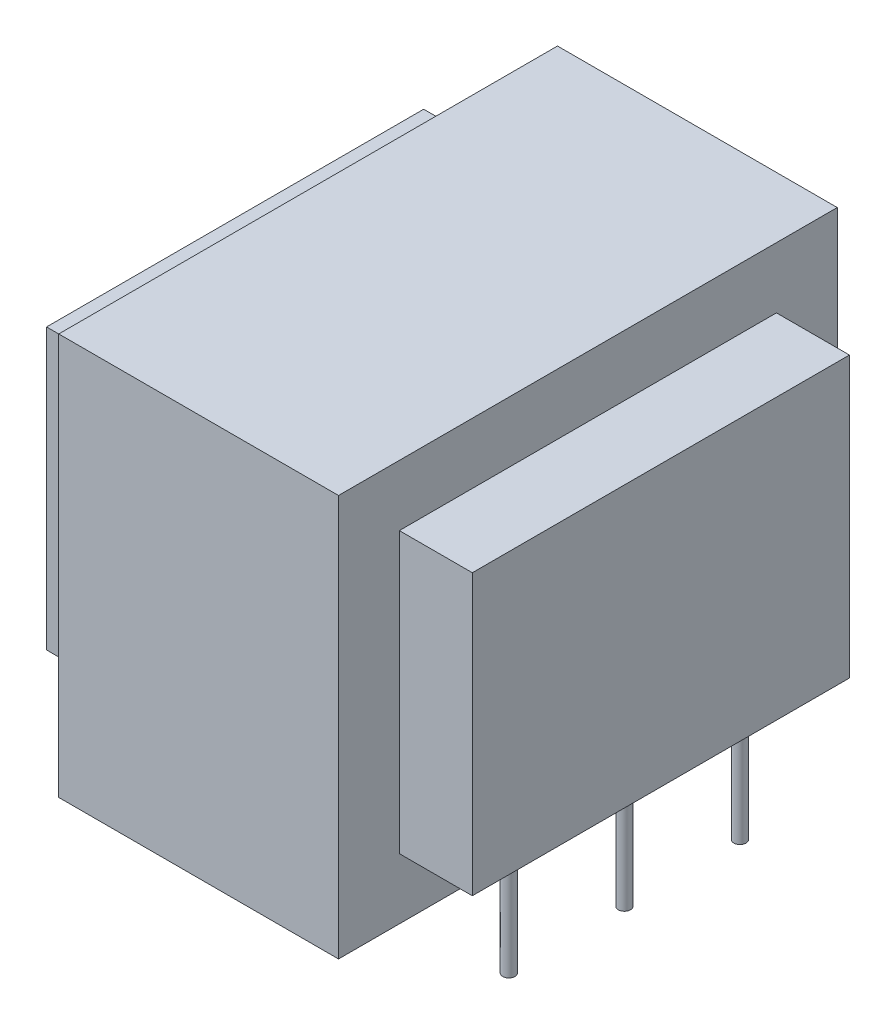
ISO-10303-21;
HEADER;
FILE_DESCRIPTION(('STEP AP214'),'2;1');
FILE_NAME('part.step','',(''),(''),'','','');
FILE_SCHEMA(('AUTOMOTIVE_DESIGN { 1 0 10303 214 1 1 1 1 }'));
ENDSEC;
DATA;
#1=APPLICATION_CONTEXT('core data for automotive mechanical design processes');
#2=APPLICATION_PROTOCOL_DEFINITION('international standard','automotive_design',2000,#1);
#3=PRODUCT_CONTEXT('',#1,'mechanical');
#4=PRODUCT('Part','Part','',(#3));
#5=PRODUCT_RELATED_PRODUCT_CATEGORY('part','',(#4));
#6=PRODUCT_DEFINITION_FORMATION('','',#4);
#7=PRODUCT_DEFINITION_CONTEXT('part definition',#1,'design');
#8=PRODUCT_DEFINITION('design','',#6,#7);
#9=PRODUCT_DEFINITION_SHAPE('','',#8);
#10=(LENGTH_UNIT() NAMED_UNIT(*) SI_UNIT(.MILLI.,.METRE.));
#11=(NAMED_UNIT(*) PLANE_ANGLE_UNIT() SI_UNIT($,.RADIAN.));
#12=(NAMED_UNIT(*) SI_UNIT($,.STERADIAN.) SOLID_ANGLE_UNIT());
#13=UNCERTAINTY_MEASURE_WITH_UNIT(LENGTH_MEASURE(1.E-05),#10,'distance_accuracy_value','');
#14=(GEOMETRIC_REPRESENTATION_CONTEXT(3) GLOBAL_UNCERTAINTY_ASSIGNED_CONTEXT((#13)) GLOBAL_UNIT_ASSIGNED_CONTEXT((#10,
#11,#12)) REPRESENTATION_CONTEXT('',''));
#15=CARTESIAN_POINT('',(0.,0.,0.));
#16=DIRECTION('',(0.,0.,1.));
#17=DIRECTION('',(1.,0.,0.));
#18=AXIS2_PLACEMENT_3D('',#15,#16,#17);
#19=CARTESIAN_POINT('',(0.,33.,0.));
#20=DIRECTION('',(0.,0.,-1.));
#21=DIRECTION('',(-1.,0.,0.));
#22=AXIS2_PLACEMENT_3D('',#19,#20,#21);
#23=PLANE('',#22);
#24=DIRECTION('',(0.,-1.,0.));
#25=VECTOR('',#24,1.);
#26=CARTESIAN_POINT('',(6.,0.,0.));
#27=LINE('',#26,#25);
#28=CARTESIAN_POINT('',(6.,33.,0.));
#29=VERTEX_POINT('',#28);
#30=CARTESIAN_POINT('',(6.,0.,0.));
#31=VERTEX_POINT('',#30);
#32=EDGE_CURVE('E157',#29,#31,#27,.T.);
#33=ORIENTED_EDGE('',*,*,#32,.T.);
#34=DIRECTION('',(1.,0.,0.));
#35=VECTOR('',#34,1.);
#36=CARTESIAN_POINT('',(0.,0.,0.));
#37=LINE('',#36,#35);
#38=CARTESIAN_POINT('',(29.,0.,0.));
#39=VERTEX_POINT('',#38);
#40=EDGE_CURVE('E210',#31,#39,#37,.T.);
#41=ORIENTED_EDGE('',*,*,#40,.T.);
#42=DIRECTION('',(0.,-1.,0.));
#43=VECTOR('',#42,1.);
#44=CARTESIAN_POINT('',(29.,0.,0.));
#45=LINE('',#44,#43);
#46=CARTESIAN_POINT('',(29.,33.,0.));
#47=VERTEX_POINT('',#46);
#48=EDGE_CURVE('E186',#47,#39,#45,.T.);
#49=ORIENTED_EDGE('',*,*,#48,.F.);
#50=DIRECTION('',(1.,0.,0.));
#51=VECTOR('',#50,1.);
#52=CARTESIAN_POINT('',(0.,33.,0.));
#53=LINE('',#52,#51);
#54=EDGE_CURVE('E217',#29,#47,#53,.T.);
#55=ORIENTED_EDGE('',*,*,#54,.F.);
#56=EDGE_LOOP('',(#33,#41,#49,#55));
#57=FACE_BOUND('',#56,.T.);
#58=ADVANCED_FACE('F36',(#57),#23,.F.);
#59=CARTESIAN_POINT('',(0.,33.,-41.));
#60=DIRECTION('',(0.,0.,1.));
#61=DIRECTION('',(1.,0.,0.));
#62=AXIS2_PLACEMENT_3D('',#59,#60,#61);
#63=PLANE('',#62);
#64=DIRECTION('',(0.,1.,0.));
#65=VECTOR('',#64,1.);
#66=CARTESIAN_POINT('',(6.,0.,-41.));
#67=LINE('',#66,#65);
#68=CARTESIAN_POINT('',(6.,0.,-41.));
#69=VERTEX_POINT('',#68);
#70=CARTESIAN_POINT('',(6.,33.,-41.));
#71=VERTEX_POINT('',#70);
#72=EDGE_CURVE('E51',#69,#71,#67,.T.);
#73=ORIENTED_EDGE('',*,*,#72,.T.);
#74=DIRECTION('',(-1.,0.,0.));
#75=VECTOR('',#74,1.);
#76=CARTESIAN_POINT('',(0.,33.,-41.));
#77=LINE('',#76,#75);
#78=CARTESIAN_POINT('',(29.,33.,-41.));
#79=VERTEX_POINT('',#78);
#80=EDGE_CURVE('E219',#79,#71,#77,.T.);
#81=ORIENTED_EDGE('',*,*,#80,.F.);
#82=DIRECTION('',(0.,1.,0.));
#83=VECTOR('',#82,1.);
#84=CARTESIAN_POINT('',(29.,0.,-41.));
#85=LINE('',#84,#83);
#86=CARTESIAN_POINT('',(29.,0.,-41.));
#87=VERTEX_POINT('',#86);
#88=EDGE_CURVE('E191',#87,#79,#85,.T.);
#89=ORIENTED_EDGE('',*,*,#88,.F.);
#90=DIRECTION('',(-1.,0.,0.));
#91=VECTOR('',#90,1.);
#92=CARTESIAN_POINT('',(0.,0.,-41.));
#93=LINE('',#92,#91);
#94=EDGE_CURVE('E220',#87,#69,#93,.T.);
#95=ORIENTED_EDGE('',*,*,#94,.T.);
#96=EDGE_LOOP('',(#73,#81,#89,#95));
#97=FACE_BOUND('',#96,.T.);
#98=ADVANCED_FACE('F249',(#97),#63,.F.);
#99=CARTESIAN_POINT('',(0.,33.,0.));
#100=DIRECTION('',(0.,-1.,0.));
#101=DIRECTION('',(0.,0.,-1.));
#102=AXIS2_PLACEMENT_3D('',#99,#100,#101);
#103=PLANE('',#102);
#104=DIRECTION('',(0.,0.,1.));
#105=VECTOR('',#104,1.);
#106=CARTESIAN_POINT('',(6.,33.,0.));
#107=LINE('',#106,#105);
#108=EDGE_CURVE('E160',#71,#29,#107,.T.);
#109=ORIENTED_EDGE('',*,*,#108,.T.);
#110=ORIENTED_EDGE('',*,*,#54,.T.);
#111=DIRECTION('',(0.,0.,1.));
#112=VECTOR('',#111,1.);
#113=CARTESIAN_POINT('',(29.,33.,0.));
#114=LINE('',#113,#112);
#115=EDGE_CURVE('E193',#79,#47,#114,.T.);
#116=ORIENTED_EDGE('',*,*,#115,.F.);
#117=ORIENTED_EDGE('',*,*,#80,.T.);
#118=EDGE_LOOP('',(#109,#110,#116,#117));
#119=FACE_BOUND('',#118,.T.);
#120=ADVANCED_FACE('F254',(#119),#103,.F.);
#121=CARTESIAN_POINT('',(0.,0.,0.));
#122=DIRECTION('',(0.,-1.,0.));
#123=DIRECTION('',(0.,0.,-1.));
#124=AXIS2_PLACEMENT_3D('',#121,#122,#123);
#125=PLANE('',#124);
#126=ORIENTED_EDGE('',*,*,#40,.F.);
#127=DIRECTION('',(0.,0.,-1.));
#128=VECTOR('',#127,1.);
#129=CARTESIAN_POINT('',(6.,0.,0.));
#130=LINE('',#129,#128);
#131=EDGE_CURVE('E133',#31,#69,#130,.T.);
#132=ORIENTED_EDGE('',*,*,#131,.T.);
#133=ORIENTED_EDGE('',*,*,#94,.F.);
#134=DIRECTION('',(0.,0.,-1.));
#135=VECTOR('',#134,1.);
#136=CARTESIAN_POINT('',(29.,0.,0.));
#137=LINE('',#136,#135);
#138=EDGE_CURVE('E189',#39,#87,#137,.T.);
#139=ORIENTED_EDGE('',*,*,#138,.F.);
#140=EDGE_LOOP('',(#126,#132,#133,#139));
#141=FACE_BOUND('',#140,.T.);
#142=ADVANCED_FACE('F262',(#141),#125,.T.);
#143=CARTESIAN_POINT('',(29.,28.,0.));
#144=DIRECTION('',(0.,1.,0.));
#145=DIRECTION('',(0.,0.,1.));
#146=AXIS2_PLACEMENT_3D('',#143,#144,#145);
#147=PLANE('',#146);
#148=DIRECTION('',(0.,0.,1.));
#149=VECTOR('',#148,1.);
#150=CARTESIAN_POINT('',(35.,28.,0.));
#151=LINE('',#150,#149);
#152=CARTESIAN_POINT('',(35.,28.,-36.));
#153=VERTEX_POINT('',#152);
#154=CARTESIAN_POINT('',(35.,28.,-5.));
#155=VERTEX_POINT('',#154);
#156=EDGE_CURVE('E172',#153,#155,#151,.T.);
#157=ORIENTED_EDGE('',*,*,#156,.F.);
#158=DIRECTION('',(1.,0.,0.));
#159=VECTOR('',#158,1.);
#160=CARTESIAN_POINT('',(29.,28.,-36.));
#161=LINE('',#160,#159);
#162=CARTESIAN_POINT('',(29.,28.,-36.));
#163=VERTEX_POINT('',#162);
#164=EDGE_CURVE('E196',#163,#153,#161,.T.);
#165=ORIENTED_EDGE('',*,*,#164,.F.);
#166=DIRECTION('',(0.,0.,1.));
#167=VECTOR('',#166,1.);
#168=CARTESIAN_POINT('',(29.,28.,0.));
#169=LINE('',#168,#167);
#170=CARTESIAN_POINT('',(29.,28.,-5.));
#171=VERTEX_POINT('',#170);
#172=EDGE_CURVE('E176',#163,#171,#169,.T.);
#173=ORIENTED_EDGE('',*,*,#172,.T.);
#174=DIRECTION('',(1.,0.,0.));
#175=VECTOR('',#174,1.);
#176=CARTESIAN_POINT('',(29.,28.,-5.));
#177=LINE('',#176,#175);
#178=EDGE_CURVE('E207',#171,#155,#177,.T.);
#179=ORIENTED_EDGE('',*,*,#178,.T.);
#180=EDGE_LOOP('',(#157,#165,#173,#179));
#181=FACE_BOUND('',#180,.T.);
#182=ADVANCED_FACE('F265',(#181),#147,.T.);
#183=CARTESIAN_POINT('',(29.,0.,-5.));
#184=DIRECTION('',(0.,0.,1.));
#185=DIRECTION('',(1.,0.,0.));
#186=AXIS2_PLACEMENT_3D('',#183,#184,#185);
#187=PLANE('',#186);
#188=DIRECTION('',(0.,-1.,0.));
#189=VECTOR('',#188,1.);
#190=CARTESIAN_POINT('',(35.,0.,-5.));
#191=LINE('',#190,#189);
#192=CARTESIAN_POINT('',(35.,5.,-5.));
#193=VERTEX_POINT('',#192);
#194=EDGE_CURVE('E180',#155,#193,#191,.T.);
#195=ORIENTED_EDGE('',*,*,#194,.F.);
#196=ORIENTED_EDGE('',*,*,#178,.F.);
#197=DIRECTION('',(0.,-1.,0.));
#198=VECTOR('',#197,1.);
#199=CARTESIAN_POINT('',(29.,0.,-5.));
#200=LINE('',#199,#198);
#201=CARTESIAN_POINT('',(29.,5.,-5.));
#202=VERTEX_POINT('',#201);
#203=EDGE_CURVE('E184',#171,#202,#200,.T.);
#204=ORIENTED_EDGE('',*,*,#203,.T.);
#205=DIRECTION('',(1.,0.,0.));
#206=VECTOR('',#205,1.);
#207=CARTESIAN_POINT('',(29.,5.,-5.));
#208=LINE('',#207,#206);
#209=EDGE_CURVE('E211',#202,#193,#208,.T.);
#210=ORIENTED_EDGE('',*,*,#209,.T.);
#211=EDGE_LOOP('',(#195,#196,#204,#210));
#212=FACE_BOUND('',#211,.T.);
#213=ADVANCED_FACE('F272',(#212),#187,.T.);
#214=CARTESIAN_POINT('',(29.,5.,0.));
#215=DIRECTION('',(0.,-1.,0.));
#216=DIRECTION('',(0.,0.,-1.));
#217=AXIS2_PLACEMENT_3D('',#214,#215,#216);
#218=PLANE('',#217);
#219=CARTESIAN_POINT('',(32.,5.,-20.5));
#220=DIRECTION('',(0.,-1.,0.));
#221=DIRECTION('',(0.,0.,1.));
#222=AXIS2_PLACEMENT_3D('',#219,#220,#221);
#223=CIRCLE('',#222,0.499999999999999);
#224=CARTESIAN_POINT('',(32.,5.,-20.));
#225=VERTEX_POINT('',#224);
#226=EDGE_CURVE('E340',#225,#225,#223,.T.);
#227=ORIENTED_EDGE('',*,*,#226,.F.);
#228=EDGE_LOOP('',(#227));
#229=FACE_BOUND('',#228,.T.);
#230=CARTESIAN_POINT('',(32.,5.,-11.));
#231=DIRECTION('',(0.,-1.,0.));
#232=DIRECTION('',(0.,0.,1.));
#233=AXIS2_PLACEMENT_3D('',#230,#231,#232);
#234=CIRCLE('',#233,0.499999999999999);
#235=CARTESIAN_POINT('',(32.,5.,-10.5));
#236=VERTEX_POINT('',#235);
#237=EDGE_CURVE('E339',#236,#236,#234,.T.);
#238=ORIENTED_EDGE('',*,*,#237,.F.);
#239=EDGE_LOOP('',(#238));
#240=FACE_BOUND('',#239,.T.);
#241=CARTESIAN_POINT('',(32.,5.,-30.));
#242=DIRECTION('',(0.,-1.,0.));
#243=DIRECTION('',(0.,0.,-1.));
#244=AXIS2_PLACEMENT_3D('',#241,#242,#243);
#245=CIRCLE('',#244,0.499999999999999);
#246=CARTESIAN_POINT('',(32.,5.,-30.5));
#247=VERTEX_POINT('',#246);
#248=EDGE_CURVE('E349',#247,#247,#245,.T.);
#249=ORIENTED_EDGE('',*,*,#248,.F.);
#250=EDGE_LOOP('',(#249));
#251=FACE_BOUND('',#250,.T.);
#252=DIRECTION('',(0.,0.,-1.));
#253=VECTOR('',#252,1.);
#254=CARTESIAN_POINT('',(35.,5.,0.));
#255=LINE('',#254,#253);
#256=CARTESIAN_POINT('',(35.,5.,-36.));
#257=VERTEX_POINT('',#256);
#258=EDGE_CURVE('E202',#193,#257,#255,.T.);
#259=ORIENTED_EDGE('',*,*,#258,.F.);
#260=ORIENTED_EDGE('',*,*,#209,.F.);
#261=DIRECTION('',(0.,0.,-1.));
#262=VECTOR('',#261,1.);
#263=CARTESIAN_POINT('',(29.,5.,0.));
#264=LINE('',#263,#262);
#265=CARTESIAN_POINT('',(29.,5.,-36.));
#266=VERTEX_POINT('',#265);
#267=EDGE_CURVE('E182',#202,#266,#264,.T.);
#268=ORIENTED_EDGE('',*,*,#267,.T.);
#269=DIRECTION('',(1.,0.,0.));
#270=VECTOR('',#269,1.);
#271=CARTESIAN_POINT('',(29.,5.,-36.));
#272=LINE('',#271,#270);
#273=EDGE_CURVE('E213',#266,#257,#272,.T.);
#274=ORIENTED_EDGE('',*,*,#273,.T.);
#275=EDGE_LOOP('',(#259,#260,#268,#274));
#276=FACE_BOUND('',#275,.T.);
#277=ADVANCED_FACE('F277',(#229,#240,#251,#276),#218,.T.);
#278=CARTESIAN_POINT('',(29.,0.,-36.));
#279=DIRECTION('',(0.,0.,-1.));
#280=DIRECTION('',(0.,1.,0.));
#281=AXIS2_PLACEMENT_3D('',#278,#279,#280);
#282=PLANE('',#281);
#283=DIRECTION('',(0.,1.,0.));
#284=VECTOR('',#283,1.);
#285=CARTESIAN_POINT('',(35.,0.,-36.));
#286=LINE('',#285,#284);
#287=EDGE_CURVE('E199',#257,#153,#286,.T.);
#288=ORIENTED_EDGE('',*,*,#287,.F.);
#289=ORIENTED_EDGE('',*,*,#273,.F.);
#290=DIRECTION('',(0.,1.,0.));
#291=VECTOR('',#290,1.);
#292=CARTESIAN_POINT('',(29.,0.,-36.));
#293=LINE('',#292,#291);
#294=EDGE_CURVE('E179',#266,#163,#293,.T.);
#295=ORIENTED_EDGE('',*,*,#294,.T.);
#296=ORIENTED_EDGE('',*,*,#164,.T.);
#297=EDGE_LOOP('',(#288,#289,#295,#296));
#298=FACE_BOUND('',#297,.T.);
#299=ADVANCED_FACE('F274',(#298),#282,.T.);
#300=CARTESIAN_POINT('',(29.,0.,0.));
#301=DIRECTION('',(1.,0.,0.));
#302=DIRECTION('',(0.,0.,-1.));
#303=AXIS2_PLACEMENT_3D('',#300,#301,#302);
#304=PLANE('',#303);
#305=ORIENTED_EDGE('',*,*,#172,.F.);
#306=ORIENTED_EDGE('',*,*,#294,.F.);
#307=ORIENTED_EDGE('',*,*,#267,.F.);
#308=ORIENTED_EDGE('',*,*,#203,.F.);
#309=EDGE_LOOP('',(#305,#306,#307,#308));
#310=FACE_BOUND('',#309,.T.);
#311=ORIENTED_EDGE('',*,*,#48,.T.);
#312=ORIENTED_EDGE('',*,*,#138,.T.);
#313=ORIENTED_EDGE('',*,*,#88,.T.);
#314=ORIENTED_EDGE('',*,*,#115,.T.);
#315=EDGE_LOOP('',(#311,#312,#313,#314));
#316=FACE_BOUND('',#315,.T.);
#317=ADVANCED_FACE('F259',(#310,#316),#304,.T.);
#318=CARTESIAN_POINT('',(35.,33.,0.));
#319=DIRECTION('',(-1.,0.,0.));
#320=DIRECTION('',(0.,0.,1.));
#321=AXIS2_PLACEMENT_3D('',#318,#319,#320);
#322=PLANE('',#321);
#323=ORIENTED_EDGE('',*,*,#156,.T.);
#324=ORIENTED_EDGE('',*,*,#194,.T.);
#325=ORIENTED_EDGE('',*,*,#258,.T.);
#326=ORIENTED_EDGE('',*,*,#287,.T.);
#327=EDGE_LOOP('',(#323,#324,#325,#326));
#328=FACE_BOUND('',#327,.T.);
#329=ADVANCED_FACE('F245',(#328),#322,.F.);
#330=CARTESIAN_POINT('',(6.,28.,0.));
#331=DIRECTION('',(0.,-1.,0.));
#332=DIRECTION('',(0.,0.,-1.));
#333=AXIS2_PLACEMENT_3D('',#330,#331,#332);
#334=PLANE('',#333);
#335=DIRECTION('',(0.,0.,1.));
#336=VECTOR('',#335,1.);
#337=CARTESIAN_POINT('',(0.,28.,0.));
#338=LINE('',#337,#336);
#339=CARTESIAN_POINT('',(0.,28.,-36.));
#340=VERTEX_POINT('',#339);
#341=CARTESIAN_POINT('',(0.,28.,-5.));
#342=VERTEX_POINT('',#341);
#343=EDGE_CURVE('E59',#340,#342,#338,.T.);
#344=ORIENTED_EDGE('',*,*,#343,.T.);
#345=DIRECTION('',(-1.,0.,0.));
#346=VECTOR('',#345,1.);
#347=CARTESIAN_POINT('',(6.,28.,-5.));
#348=LINE('',#347,#346);
#349=CARTESIAN_POINT('',(6.,28.,-5.));
#350=VERTEX_POINT('',#349);
#351=EDGE_CURVE('E123',#350,#342,#348,.T.);
#352=ORIENTED_EDGE('',*,*,#351,.F.);
#353=DIRECTION('',(0.,0.,1.));
#354=VECTOR('',#353,1.);
#355=CARTESIAN_POINT('',(6.,28.,0.));
#356=LINE('',#355,#354);
#357=CARTESIAN_POINT('',(6.,28.,-36.));
#358=VERTEX_POINT('',#357);
#359=EDGE_CURVE('E127',#358,#350,#356,.T.);
#360=ORIENTED_EDGE('',*,*,#359,.F.);
#361=DIRECTION('',(-1.,0.,0.));
#362=VECTOR('',#361,1.);
#363=CARTESIAN_POINT('',(6.,28.,-36.));
#364=LINE('',#363,#362);
#365=EDGE_CURVE('E170',#358,#340,#364,.T.);
#366=ORIENTED_EDGE('',*,*,#365,.T.);
#367=EDGE_LOOP('',(#344,#352,#360,#366));
#368=FACE_BOUND('',#367,.T.);
#369=ADVANCED_FACE('F125',(#368),#334,.F.);
#370=CARTESIAN_POINT('',(6.,0.,-36.));
#371=DIRECTION('',(0.,0.,1.));
#372=DIRECTION('',(0.,-1.,0.));
#373=AXIS2_PLACEMENT_3D('',#370,#371,#372);
#374=PLANE('',#373);
#375=DIRECTION('',(0.,1.,0.));
#376=VECTOR('',#375,1.);
#377=CARTESIAN_POINT('',(0.,0.,-36.));
#378=LINE('',#377,#376);
#379=CARTESIAN_POINT('',(0.,5.,-36.));
#380=VERTEX_POINT('',#379);
#381=EDGE_CURVE('E146',#380,#340,#378,.T.);
#382=ORIENTED_EDGE('',*,*,#381,.T.);
#383=ORIENTED_EDGE('',*,*,#365,.F.);
#384=DIRECTION('',(0.,1.,0.));
#385=VECTOR('',#384,1.);
#386=CARTESIAN_POINT('',(6.,0.,-36.));
#387=LINE('',#386,#385);
#388=CARTESIAN_POINT('',(6.,5.,-36.));
#389=VERTEX_POINT('',#388);
#390=EDGE_CURVE('E145',#389,#358,#387,.T.);
#391=ORIENTED_EDGE('',*,*,#390,.F.);
#392=DIRECTION('',(-1.,0.,0.));
#393=VECTOR('',#392,1.);
#394=CARTESIAN_POINT('',(6.,5.,-36.));
#395=LINE('',#394,#393);
#396=EDGE_CURVE('E173',#389,#380,#395,.T.);
#397=ORIENTED_EDGE('',*,*,#396,.T.);
#398=EDGE_LOOP('',(#382,#383,#391,#397));
#399=FACE_BOUND('',#398,.T.);
#400=ADVANCED_FACE('F233',(#399),#374,.F.);
#401=CARTESIAN_POINT('',(6.,5.,0.));
#402=DIRECTION('',(0.,1.,0.));
#403=DIRECTION('',(0.,0.,1.));
#404=AXIS2_PLACEMENT_3D('',#401,#402,#403);
#405=PLANE('',#404);
#406=CARTESIAN_POINT('',(3.00000000000001,5.,-30.));
#407=DIRECTION('',(0.,1.,0.));
#408=DIRECTION('',(0.,0.,1.));
#409=AXIS2_PLACEMENT_3D('',#406,#407,#408);
#410=CIRCLE('',#409,0.5);
#411=CARTESIAN_POINT('',(3.00000000000001,5.,-29.5));
#412=VERTEX_POINT('',#411);
#413=EDGE_CURVE('E11',#412,#412,#410,.F.);
#414=ORIENTED_EDGE('',*,*,#413,.F.);
#415=EDGE_LOOP('',(#414));
#416=FACE_BOUND('',#415,.T.);
#417=CARTESIAN_POINT('',(3.00000000000001,5.,-11.));
#418=DIRECTION('',(0.,1.,0.));
#419=DIRECTION('',(0.,0.,1.));
#420=AXIS2_PLACEMENT_3D('',#417,#418,#419);
#421=CIRCLE('',#420,0.5);
#422=CARTESIAN_POINT('',(3.00000000000001,5.,-10.5));
#423=VERTEX_POINT('',#422);
#424=EDGE_CURVE('E44',#423,#423,#421,.F.);
#425=ORIENTED_EDGE('',*,*,#424,.F.);
#426=EDGE_LOOP('',(#425));
#427=FACE_BOUND('',#426,.T.);
#428=DIRECTION('',(0.,0.,-1.));
#429=VECTOR('',#428,1.);
#430=CARTESIAN_POINT('',(0.,5.,0.));
#431=LINE('',#430,#429);
#432=CARTESIAN_POINT('',(0.,5.,-5.));
#433=VERTEX_POINT('',#432);
#434=EDGE_CURVE('E149',#433,#380,#431,.T.);
#435=ORIENTED_EDGE('',*,*,#434,.T.);
#436=ORIENTED_EDGE('',*,*,#396,.F.);
#437=DIRECTION('',(0.,0.,-1.));
#438=VECTOR('',#437,1.);
#439=CARTESIAN_POINT('',(6.,5.,0.));
#440=LINE('',#439,#438);
#441=CARTESIAN_POINT('',(6.,5.,-5.));
#442=VERTEX_POINT('',#441);
#443=EDGE_CURVE('E141',#442,#389,#440,.T.);
#444=ORIENTED_EDGE('',*,*,#443,.F.);
#445=DIRECTION('',(-1.,0.,0.));
#446=VECTOR('',#445,1.);
#447=CARTESIAN_POINT('',(6.,5.,-5.));
#448=LINE('',#447,#446);
#449=EDGE_CURVE('E132',#442,#433,#448,.T.);
#450=ORIENTED_EDGE('',*,*,#449,.T.);
#451=EDGE_LOOP('',(#435,#436,#444,#450));
#452=FACE_BOUND('',#451,.T.);
#453=ADVANCED_FACE('F230',(#416,#427,#452),#405,.F.);
#454=CARTESIAN_POINT('',(6.,0.,-5.));
#455=DIRECTION('',(0.,0.,-1.));
#456=DIRECTION('',(-1.,0.,0.));
#457=AXIS2_PLACEMENT_3D('',#454,#455,#456);
#458=PLANE('',#457);
#459=DIRECTION('',(0.,-1.,0.));
#460=VECTOR('',#459,1.);
#461=CARTESIAN_POINT('',(0.,0.,-5.));
#462=LINE('',#461,#460);
#463=EDGE_CURVE('E166',#342,#433,#462,.T.);
#464=ORIENTED_EDGE('',*,*,#463,.T.);
#465=ORIENTED_EDGE('',*,*,#449,.F.);
#466=DIRECTION('',(0.,-1.,0.));
#467=VECTOR('',#466,1.);
#468=CARTESIAN_POINT('',(6.,0.,-5.));
#469=LINE('',#468,#467);
#470=EDGE_CURVE('E136',#350,#442,#469,.T.);
#471=ORIENTED_EDGE('',*,*,#470,.F.);
#472=ORIENTED_EDGE('',*,*,#351,.T.);
#473=EDGE_LOOP('',(#464,#465,#471,#472));
#474=FACE_BOUND('',#473,.T.);
#475=ADVANCED_FACE('F137',(#474),#458,.F.);
#476=CARTESIAN_POINT('',(6.,0.,0.));
#477=DIRECTION('',(-1.,0.,0.));
#478=DIRECTION('',(0.,0.,-1.));
#479=AXIS2_PLACEMENT_3D('',#476,#477,#478);
#480=PLANE('',#479);
#481=ORIENTED_EDGE('',*,*,#359,.T.);
#482=ORIENTED_EDGE('',*,*,#470,.T.);
#483=ORIENTED_EDGE('',*,*,#443,.T.);
#484=ORIENTED_EDGE('',*,*,#390,.T.);
#485=EDGE_LOOP('',(#481,#482,#483,#484));
#486=FACE_BOUND('',#485,.T.);
#487=ORIENTED_EDGE('',*,*,#32,.F.);
#488=ORIENTED_EDGE('',*,*,#108,.F.);
#489=ORIENTED_EDGE('',*,*,#72,.F.);
#490=ORIENTED_EDGE('',*,*,#131,.F.);
#491=EDGE_LOOP('',(#487,#488,#489,#490));
#492=FACE_BOUND('',#491,.T.);
#493=ADVANCED_FACE('F143',(#486,#492),#480,.T.);
#494=CARTESIAN_POINT('',(0.,33.,0.));
#495=DIRECTION('',(1.,0.,0.));
#496=DIRECTION('',(0.,0.,-1.));
#497=AXIS2_PLACEMENT_3D('',#494,#495,#496);
#498=PLANE('',#497);
#499=ORIENTED_EDGE('',*,*,#463,.F.);
#500=ORIENTED_EDGE('',*,*,#343,.F.);
#501=ORIENTED_EDGE('',*,*,#381,.F.);
#502=ORIENTED_EDGE('',*,*,#434,.F.);
#503=EDGE_LOOP('',(#499,#500,#501,#502));
#504=FACE_BOUND('',#503,.T.);
#505=ADVANCED_FACE('F38',(#504),#498,.F.);
#506=CARTESIAN_POINT('',(3.00000000000001,-5.,-11.));
#507=DIRECTION('',(0.,1.,0.));
#508=DIRECTION('',(0.,0.,1.));
#509=AXIS2_PLACEMENT_3D('',#506,#507,#508);
#510=CYLINDRICAL_SURFACE('',#509,0.5);
#511=CARTESIAN_POINT('',(3.00000000000001,-5.,-11.));
#512=DIRECTION('',(0.,-1.,0.));
#513=DIRECTION('',(0.,0.,-1.));
#514=AXIS2_PLACEMENT_3D('',#511,#512,#513);
#515=CIRCLE('',#514,0.5);
#516=CARTESIAN_POINT('',(3.00000000000001,-5.,-11.5));
#517=VERTEX_POINT('',#516);
#518=EDGE_CURVE('E152',#517,#517,#515,.T.);
#519=ORIENTED_EDGE('',*,*,#518,.F.);
#520=EDGE_LOOP('',(#519));
#521=FACE_BOUND('',#520,.T.);
#522=ORIENTED_EDGE('',*,*,#424,.T.);
#523=EDGE_LOOP('',(#522));
#524=FACE_BOUND('',#523,.T.);
#525=ADVANCED_FACE('F228',(#521,#524),#510,.T.);
#526=CARTESIAN_POINT('',(3.00000000000001,-5.,-11.));
#527=DIRECTION('',(0.,-1.,0.));
#528=DIRECTION('',(0.,0.,-1.));
#529=AXIS2_PLACEMENT_3D('',#526,#527,#528);
#530=PLANE('',#529);
#531=ORIENTED_EDGE('',*,*,#518,.T.);
#532=EDGE_LOOP('',(#531));
#533=FACE_BOUND('',#532,.T.);
#534=ADVANCED_FACE('F298',(#533),#530,.T.);
#535=CARTESIAN_POINT('',(3.00000000000001,-5.,-30.));
#536=DIRECTION('',(0.,1.,0.));
#537=DIRECTION('',(0.,0.,1.));
#538=AXIS2_PLACEMENT_3D('',#535,#536,#537);
#539=CYLINDRICAL_SURFACE('',#538,0.5);
#540=CARTESIAN_POINT('',(3.00000000000001,-5.,-30.));
#541=DIRECTION('',(0.,-1.,0.));
#542=DIRECTION('',(0.,0.,1.));
#543=AXIS2_PLACEMENT_3D('',#540,#541,#542);
#544=CIRCLE('',#543,0.5);
#545=CARTESIAN_POINT('',(3.00000000000001,-5.,-29.5));
#546=VERTEX_POINT('',#545);
#547=EDGE_CURVE('E354',#546,#546,#544,.T.);
#548=ORIENTED_EDGE('',*,*,#547,.F.);
#549=EDGE_LOOP('',(#548));
#550=FACE_BOUND('',#549,.T.);
#551=ORIENTED_EDGE('',*,*,#413,.T.);
#552=EDGE_LOOP('',(#551));
#553=FACE_BOUND('',#552,.T.);
#554=ADVANCED_FACE('F302',(#550,#553),#539,.T.);
#555=CARTESIAN_POINT('',(3.00000000000001,-5.,-30.));
#556=DIRECTION('',(0.,1.,0.));
#557=DIRECTION('',(0.,0.,1.));
#558=AXIS2_PLACEMENT_3D('',#555,#556,#557);
#559=PLANE('',#558);
#560=ORIENTED_EDGE('',*,*,#547,.T.);
#561=EDGE_LOOP('',(#560));
#562=FACE_BOUND('',#561,.T.);
#563=ADVANCED_FACE('F306',(#562),#559,.F.);
#564=CARTESIAN_POINT('',(32.,-5.,-30.));
#565=DIRECTION('',(0.,1.,0.));
#566=DIRECTION('',(0.,0.,1.));
#567=AXIS2_PLACEMENT_3D('',#564,#565,#566);
#568=CYLINDRICAL_SURFACE('',#567,0.499999999999999);
#569=CARTESIAN_POINT('',(32.,-5.,-30.));
#570=DIRECTION('',(0.,-1.,0.));
#571=DIRECTION('',(0.,0.,-1.));
#572=AXIS2_PLACEMENT_3D('',#569,#570,#571);
#573=CIRCLE('',#572,0.499999999999999);
#574=CARTESIAN_POINT('',(32.,-5.,-30.5));
#575=VERTEX_POINT('',#574);
#576=EDGE_CURVE('E351',#575,#575,#573,.T.);
#577=ORIENTED_EDGE('',*,*,#576,.F.);
#578=EDGE_LOOP('',(#577));
#579=FACE_BOUND('',#578,.T.);
#580=ORIENTED_EDGE('',*,*,#248,.T.);
#581=EDGE_LOOP('',(#580));
#582=FACE_BOUND('',#581,.T.);
#583=ADVANCED_FACE('F310',(#579,#582),#568,.T.);
#584=CARTESIAN_POINT('',(32.,-5.,-30.));
#585=DIRECTION('',(0.,-1.,0.));
#586=DIRECTION('',(0.,0.,-1.));
#587=AXIS2_PLACEMENT_3D('',#584,#585,#586);
#588=PLANE('',#587);
#589=ORIENTED_EDGE('',*,*,#576,.T.);
#590=EDGE_LOOP('',(#589));
#591=FACE_BOUND('',#590,.T.);
#592=ADVANCED_FACE('F314',(#591),#588,.T.);
#593=CARTESIAN_POINT('',(32.,-5.,-11.));
#594=DIRECTION('',(0.,1.,0.));
#595=DIRECTION('',(0.,0.,1.));
#596=AXIS2_PLACEMENT_3D('',#593,#594,#595);
#597=CYLINDRICAL_SURFACE('',#596,0.499999999999999);
#598=CARTESIAN_POINT('',(32.,-5.,-11.));
#599=DIRECTION('',(0.,-1.,0.));
#600=DIRECTION('',(0.,0.,1.));
#601=AXIS2_PLACEMENT_3D('',#598,#599,#600);
#602=CIRCLE('',#601,0.499999999999999);
#603=CARTESIAN_POINT('',(32.,-5.,-10.5));
#604=VERTEX_POINT('',#603);
#605=EDGE_CURVE('E343',#604,#604,#602,.T.);
#606=ORIENTED_EDGE('',*,*,#605,.F.);
#607=EDGE_LOOP('',(#606));
#608=FACE_BOUND('',#607,.T.);
#609=ORIENTED_EDGE('',*,*,#237,.T.);
#610=EDGE_LOOP('',(#609));
#611=FACE_BOUND('',#610,.T.);
#612=ADVANCED_FACE('F318',(#608,#611),#597,.T.);
#613=CARTESIAN_POINT('',(32.,-5.,-11.));
#614=DIRECTION('',(0.,1.,0.));
#615=DIRECTION('',(0.,0.,1.));
#616=AXIS2_PLACEMENT_3D('',#613,#614,#615);
#617=PLANE('',#616);
#618=ORIENTED_EDGE('',*,*,#605,.T.);
#619=EDGE_LOOP('',(#618));
#620=FACE_BOUND('',#619,.T.);
#621=ADVANCED_FACE('F322',(#620),#617,.F.);
#622=CARTESIAN_POINT('',(32.,-5.,-20.5));
#623=DIRECTION('',(0.,1.,0.));
#624=DIRECTION('',(0.,0.,1.));
#625=AXIS2_PLACEMENT_3D('',#622,#623,#624);
#626=CYLINDRICAL_SURFACE('',#625,0.499999999999999);
#627=CARTESIAN_POINT('',(32.,-5.,-20.5));
#628=DIRECTION('',(0.,-1.,0.));
#629=DIRECTION('',(0.,0.,1.));
#630=AXIS2_PLACEMENT_3D('',#627,#628,#629);
#631=CIRCLE('',#630,0.499999999999999);
#632=CARTESIAN_POINT('',(32.,-5.,-20.));
#633=VERTEX_POINT('',#632);
#634=EDGE_CURVE('E338',#633,#633,#631,.T.);
#635=ORIENTED_EDGE('',*,*,#634,.F.);
#636=EDGE_LOOP('',(#635));
#637=FACE_BOUND('',#636,.T.);
#638=ORIENTED_EDGE('',*,*,#226,.T.);
#639=EDGE_LOOP('',(#638));
#640=FACE_BOUND('',#639,.T.);
#641=ADVANCED_FACE('F326',(#637,#640),#626,.T.);
#642=CARTESIAN_POINT('',(32.,-5.,-20.5));
#643=DIRECTION('',(0.,1.,0.));
#644=DIRECTION('',(0.,0.,1.));
#645=AXIS2_PLACEMENT_3D('',#642,#643,#644);
#646=PLANE('',#645);
#647=ORIENTED_EDGE('',*,*,#634,.T.);
#648=EDGE_LOOP('',(#647));
#649=FACE_BOUND('',#648,.T.);
#650=ADVANCED_FACE('F330',(#649),#646,.F.);
#651=CLOSED_SHELL('',(#58,#98,#120,#142,#182,#213,#277,#299,#317,#329,#369,#400,#453,#475,#493,
#505,#525,#534,#554,#563,#583,#592,#612,#621,#641,#650));
#652=MANIFOLD_SOLID_BREP('B2',#651);
#653=ADVANCED_BREP_SHAPE_REPRESENTATION('',(#18,#652),#14);
#654=SHAPE_DEFINITION_REPRESENTATION(#9,#653);
ENDSEC;
END-ISO-10303-21;
